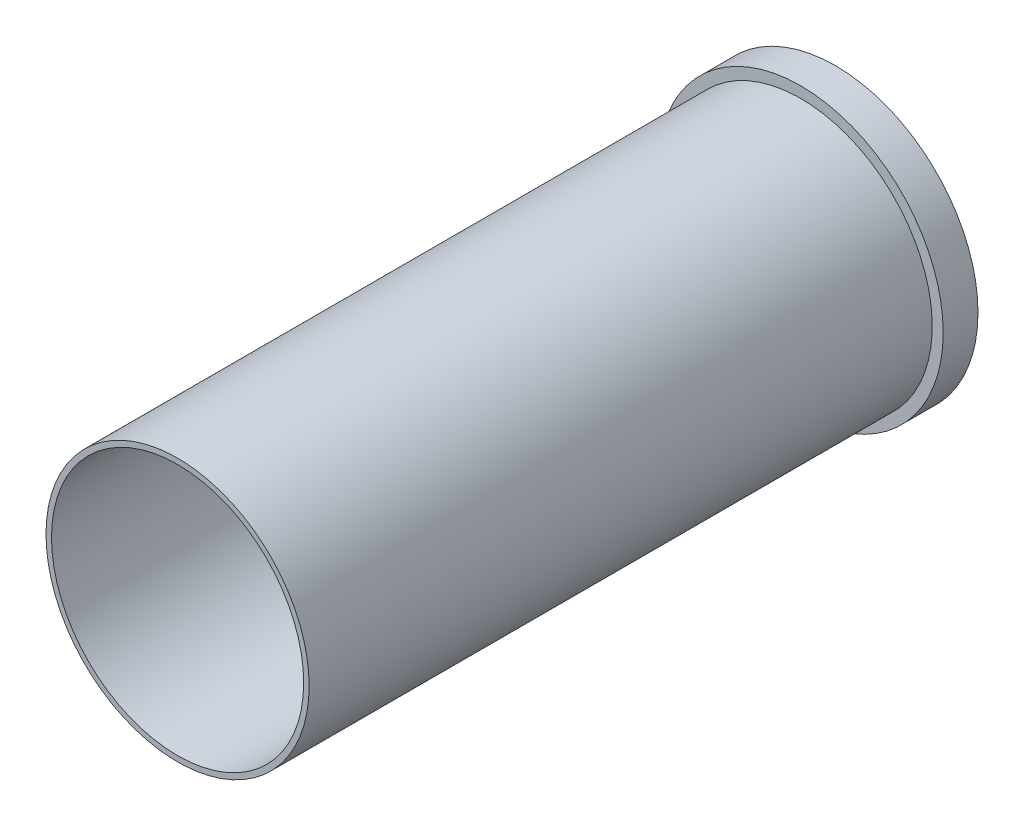
ISO-10303-21;
HEADER;
FILE_DESCRIPTION(('STEP AP214'),'2;1');
FILE_NAME('part.step','',(''),(''),'','','');
FILE_SCHEMA(('AUTOMOTIVE_DESIGN { 1 0 10303 214 1 1 1 1 }'));
ENDSEC;
DATA;
#1=APPLICATION_CONTEXT('core data for automotive mechanical design processes');
#2=APPLICATION_PROTOCOL_DEFINITION('international standard','automotive_design',2000,#1);
#3=PRODUCT_CONTEXT('',#1,'mechanical');
#4=PRODUCT('Part','Part','',(#3));
#5=PRODUCT_RELATED_PRODUCT_CATEGORY('part','',(#4));
#6=PRODUCT_DEFINITION_FORMATION('','',#4);
#7=PRODUCT_DEFINITION_CONTEXT('part definition',#1,'design');
#8=PRODUCT_DEFINITION('design','',#6,#7);
#9=PRODUCT_DEFINITION_SHAPE('','',#8);
#10=(LENGTH_UNIT() NAMED_UNIT(*) SI_UNIT(.MILLI.,.METRE.));
#11=(NAMED_UNIT(*) PLANE_ANGLE_UNIT() SI_UNIT($,.RADIAN.));
#12=(NAMED_UNIT(*) SI_UNIT($,.STERADIAN.) SOLID_ANGLE_UNIT());
#13=UNCERTAINTY_MEASURE_WITH_UNIT(LENGTH_MEASURE(1.E-05),#10,'distance_accuracy_value','');
#14=(GEOMETRIC_REPRESENTATION_CONTEXT(3) GLOBAL_UNCERTAINTY_ASSIGNED_CONTEXT((#13)) GLOBAL_UNIT_ASSIGNED_CONTEXT((#10,
#11,#12)) REPRESENTATION_CONTEXT('',''));
#15=CARTESIAN_POINT('',(0.,0.,0.));
#16=DIRECTION('',(0.,0.,1.));
#17=DIRECTION('',(1.,0.,0.));
#18=AXIS2_PLACEMENT_3D('',#15,#16,#17);
#19=CARTESIAN_POINT('',(0.,0.,60.));
#20=DIRECTION('',(0.,0.,-1.));
#21=DIRECTION('',(-1.,0.,0.));
#22=AXIS2_PLACEMENT_3D('',#19,#20,#21);
#23=CYLINDRICAL_SURFACE('',#22,24.);
#24=CARTESIAN_POINT('',(0.,0.,60.));
#25=DIRECTION('',(0.,0.,1.));
#26=DIRECTION('',(1.,0.,0.));
#27=AXIS2_PLACEMENT_3D('',#24,#25,#26);
#28=CIRCLE('',#27,24.);
#29=CARTESIAN_POINT('',(24.,0.,60.));
#30=VERTEX_POINT('',#29);
#31=EDGE_CURVE('E39',#30,#30,#28,.T.);
#32=ORIENTED_EDGE('',*,*,#31,.F.);
#33=EDGE_LOOP('',(#32));
#34=FACE_BOUND('',#33,.T.);
#35=CARTESIAN_POINT('',(0.,0.,-53.65));
#36=DIRECTION('',(0.,0.,-1.));
#37=DIRECTION('',(-1.,0.,0.));
#38=AXIS2_PLACEMENT_3D('',#35,#36,#37);
#39=CIRCLE('',#38,24.);
#40=CARTESIAN_POINT('',(-24.,0.,-53.65));
#41=VERTEX_POINT('',#40);
#42=EDGE_CURVE('E10',#41,#41,#39,.T.);
#43=ORIENTED_EDGE('',*,*,#42,.F.);
#44=EDGE_LOOP('',(#43));
#45=FACE_BOUND('',#44,.T.);
#46=ADVANCED_FACE('F33',(#34,#45),#23,.T.);
#47=CARTESIAN_POINT('',(0.,0.,60.));
#48=DIRECTION('',(0.,0.,1.));
#49=DIRECTION('',(1.,0.,0.));
#50=AXIS2_PLACEMENT_3D('',#47,#48,#49);
#51=PLANE('',#50);
#52=ORIENTED_EDGE('',*,*,#31,.T.);
#53=EDGE_LOOP('',(#52));
#54=FACE_BOUND('',#53,.T.);
#55=CARTESIAN_POINT('',(0.,0.,60.));
#56=DIRECTION('',(0.,0.,1.));
#57=DIRECTION('',(1.,0.,0.));
#58=AXIS2_PLACEMENT_3D('',#55,#56,#57);
#59=CIRCLE('',#58,23.);
#60=CARTESIAN_POINT('',(23.,0.,60.));
#61=VERTEX_POINT('',#60);
#62=EDGE_CURVE('E43',#61,#61,#59,.T.);
#63=ORIENTED_EDGE('',*,*,#62,.F.);
#64=EDGE_LOOP('',(#63));
#65=FACE_BOUND('',#64,.T.);
#66=ADVANCED_FACE('F71',(#54,#65),#51,.T.);
#67=CARTESIAN_POINT('',(0.,0.,-60.));
#68=DIRECTION('',(0.,0.,1.));
#69=DIRECTION('',(1.,0.,0.));
#70=AXIS2_PLACEMENT_3D('',#67,#68,#69);
#71=PLANE('',#70);
#72=CARTESIAN_POINT('',(0.,0.,-60.));
#73=DIRECTION('',(0.,0.,1.));
#74=DIRECTION('',(1.,0.,0.));
#75=AXIS2_PLACEMENT_3D('',#72,#73,#74);
#76=CIRCLE('',#75,23.);
#77=CARTESIAN_POINT('',(23.,0.,-60.));
#78=VERTEX_POINT('',#77);
#79=EDGE_CURVE('E47',#78,#78,#76,.T.);
#80=ORIENTED_EDGE('',*,*,#79,.T.);
#81=EDGE_LOOP('',(#80));
#82=FACE_BOUND('',#81,.T.);
#83=CARTESIAN_POINT('',(0.,0.,-60.));
#84=DIRECTION('',(0.,0.,-1.));
#85=DIRECTION('',(-1.,0.,0.));
#86=AXIS2_PLACEMENT_3D('',#83,#84,#85);
#87=CIRCLE('',#86,26.);
#88=CARTESIAN_POINT('',(-26.,0.,-60.));
#89=VERTEX_POINT('',#88);
#90=EDGE_CURVE('E53',#89,#89,#87,.T.);
#91=ORIENTED_EDGE('',*,*,#90,.T.);
#92=EDGE_LOOP('',(#91));
#93=FACE_BOUND('',#92,.T.);
#94=ADVANCED_FACE('F76',(#82,#93),#71,.F.);
#95=CARTESIAN_POINT('',(0.,0.,60.));
#96=DIRECTION('',(0.,0.,-1.));
#97=DIRECTION('',(-1.,0.,0.));
#98=AXIS2_PLACEMENT_3D('',#95,#96,#97);
#99=CYLINDRICAL_SURFACE('',#98,23.);
#100=ORIENTED_EDGE('',*,*,#62,.T.);
#101=EDGE_LOOP('',(#100));
#102=FACE_BOUND('',#101,.T.);
#103=ORIENTED_EDGE('',*,*,#79,.F.);
#104=EDGE_LOOP('',(#103));
#105=FACE_BOUND('',#104,.T.);
#106=ADVANCED_FACE('F68',(#102,#105),#99,.F.);
#107=CARTESIAN_POINT('',(0.,0.,-53.65));
#108=DIRECTION('',(0.,0.,-1.));
#109=DIRECTION('',(-1.,0.,0.));
#110=AXIS2_PLACEMENT_3D('',#107,#108,#109);
#111=CYLINDRICAL_SURFACE('',#110,26.);
#112=CARTESIAN_POINT('',(0.,0.,-53.65));
#113=DIRECTION('',(0.,0.,-1.));
#114=DIRECTION('',(-1.,0.,0.));
#115=AXIS2_PLACEMENT_3D('',#112,#113,#114);
#116=CIRCLE('',#115,26.);
#117=CARTESIAN_POINT('',(-26.,0.,-53.65));
#118=VERTEX_POINT('',#117);
#119=EDGE_CURVE('E51',#118,#118,#116,.T.);
#120=ORIENTED_EDGE('',*,*,#119,.T.);
#121=EDGE_LOOP('',(#120));
#122=FACE_BOUND('',#121,.T.);
#123=ORIENTED_EDGE('',*,*,#90,.F.);
#124=EDGE_LOOP('',(#123));
#125=FACE_BOUND('',#124,.T.);
#126=ADVANCED_FACE('F59',(#122,#125),#111,.T.);
#127=CARTESIAN_POINT('',(0.,0.,-53.65));
#128=DIRECTION('',(0.,0.,-1.));
#129=DIRECTION('',(-1.,0.,0.));
#130=AXIS2_PLACEMENT_3D('',#127,#128,#129);
#131=PLANE('',#130);
#132=ORIENTED_EDGE('',*,*,#42,.T.);
#133=EDGE_LOOP('',(#132));
#134=FACE_BOUND('',#133,.T.);
#135=ORIENTED_EDGE('',*,*,#119,.F.);
#136=EDGE_LOOP('',(#135));
#137=FACE_BOUND('',#136,.T.);
#138=ADVANCED_FACE('F62',(#134,#137),#131,.F.);
#139=CLOSED_SHELL('',(#46,#66,#94,#106,#126,#138));
#140=MANIFOLD_SOLID_BREP('B2',#139);
#141=ADVANCED_BREP_SHAPE_REPRESENTATION('',(#18,#140),#14);
#142=SHAPE_DEFINITION_REPRESENTATION(#9,#141);
ENDSEC;
END-ISO-10303-21;
